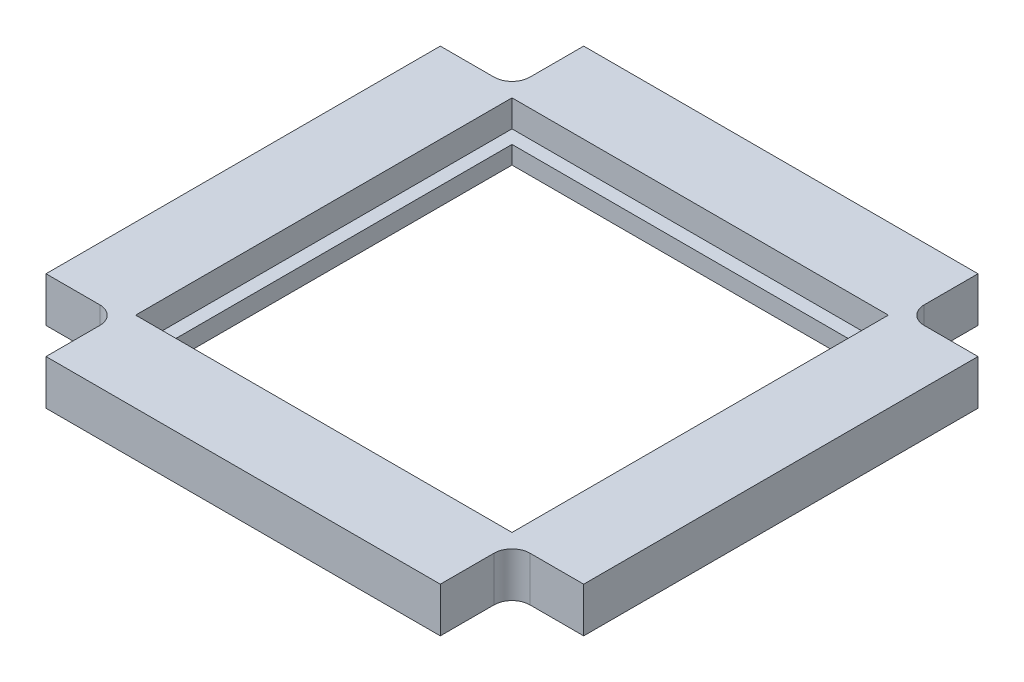
ISO-10303-21;
HEADER;
FILE_DESCRIPTION(('STEP AP214'),'2;1');
FILE_NAME('part.step','',(''),(''),'','','');
FILE_SCHEMA(('AUTOMOTIVE_DESIGN { 1 0 10303 214 1 1 1 1 }'));
ENDSEC;
DATA;
#1=APPLICATION_CONTEXT('core data for automotive mechanical design processes');
#2=APPLICATION_PROTOCOL_DEFINITION('international standard','automotive_design',2000,#1);
#3=PRODUCT_CONTEXT('',#1,'mechanical');
#4=PRODUCT('Part','Part','',(#3));
#5=PRODUCT_RELATED_PRODUCT_CATEGORY('part','',(#4));
#6=PRODUCT_DEFINITION_FORMATION('','',#4);
#7=PRODUCT_DEFINITION_CONTEXT('part definition',#1,'design');
#8=PRODUCT_DEFINITION('design','',#6,#7);
#9=PRODUCT_DEFINITION_SHAPE('','',#8);
#10=(LENGTH_UNIT() NAMED_UNIT(*) SI_UNIT(.MILLI.,.METRE.));
#11=(NAMED_UNIT(*) PLANE_ANGLE_UNIT() SI_UNIT($,.RADIAN.));
#12=(NAMED_UNIT(*) SI_UNIT($,.STERADIAN.) SOLID_ANGLE_UNIT());
#13=UNCERTAINTY_MEASURE_WITH_UNIT(LENGTH_MEASURE(1.E-05),#10,'distance_accuracy_value','');
#14=(GEOMETRIC_REPRESENTATION_CONTEXT(3) GLOBAL_UNCERTAINTY_ASSIGNED_CONTEXT((#13)) GLOBAL_UNIT_ASSIGNED_CONTEXT((#10,
#11,#12)) REPRESENTATION_CONTEXT('',''));
#15=CARTESIAN_POINT('',(0.,0.,0.));
#16=DIRECTION('',(0.,0.,1.));
#17=DIRECTION('',(1.,0.,0.));
#18=AXIS2_PLACEMENT_3D('',#15,#16,#17);
#19=CARTESIAN_POINT('',(3.,0.5,-3.));
#20=DIRECTION('',(-1.,0.,0.));
#21=DIRECTION('',(0.,0.,1.));
#22=AXIS2_PLACEMENT_3D('',#19,#20,#21);
#23=PLANE('',#22);
#24=DIRECTION('',(0.,0.,-1.));
#25=VECTOR('',#24,1.);
#26=CARTESIAN_POINT('',(3.,0.,-3.));
#27=LINE('',#26,#25);
#28=CARTESIAN_POINT('',(3.,0.,2.2));
#29=VERTEX_POINT('',#28);
#30=CARTESIAN_POINT('',(3.,0.,-2.2));
#31=VERTEX_POINT('',#30);
#32=EDGE_CURVE('E222',#29,#31,#27,.T.);
#33=ORIENTED_EDGE('',*,*,#32,.T.);
#34=DIRECTION('',(0.,1.,0.));
#35=VECTOR('',#34,1.);
#36=CARTESIAN_POINT('',(3.,0.,-2.2));
#37=LINE('',#36,#35);
#38=CARTESIAN_POINT('',(3.,0.5,-2.2));
#39=VERTEX_POINT('',#38);
#40=EDGE_CURVE('E216',#31,#39,#37,.T.);
#41=ORIENTED_EDGE('',*,*,#40,.T.);
#42=DIRECTION('',(0.,0.,-1.));
#43=VECTOR('',#42,1.);
#44=CARTESIAN_POINT('',(3.,0.5,-3.));
#45=LINE('',#44,#43);
#46=CARTESIAN_POINT('',(3.,0.5,2.2));
#47=VERTEX_POINT('',#46);
#48=EDGE_CURVE('E234',#47,#39,#45,.T.);
#49=ORIENTED_EDGE('',*,*,#48,.F.);
#50=DIRECTION('',(0.,1.,0.));
#51=VECTOR('',#50,1.);
#52=CARTESIAN_POINT('',(3.,0.,2.2));
#53=LINE('',#52,#51);
#54=EDGE_CURVE('E385',#29,#47,#53,.T.);
#55=ORIENTED_EDGE('',*,*,#54,.F.);
#56=EDGE_LOOP('',(#33,#41,#49,#55));
#57=FACE_BOUND('',#56,.T.);
#58=ADVANCED_FACE('F34',(#57),#23,.F.);
#59=CARTESIAN_POINT('',(-3.,0.5,-3.));
#60=DIRECTION('',(0.,0.,1.));
#61=DIRECTION('',(1.,0.,0.));
#62=AXIS2_PLACEMENT_3D('',#59,#60,#61);
#63=PLANE('',#62);
#64=DIRECTION('',(-1.,0.,0.));
#65=VECTOR('',#64,1.);
#66=CARTESIAN_POINT('',(-3.,0.5,-3.));
#67=LINE('',#66,#65);
#68=CARTESIAN_POINT('',(2.2,0.5,-3.));
#69=VERTEX_POINT('',#68);
#70=CARTESIAN_POINT('',(-2.2,0.5,-3.));
#71=VERTEX_POINT('',#70);
#72=EDGE_CURVE('E215',#69,#71,#67,.T.);
#73=ORIENTED_EDGE('',*,*,#72,.F.);
#74=DIRECTION('',(0.,1.,0.));
#75=VECTOR('',#74,1.);
#76=CARTESIAN_POINT('',(2.2,0.,-3.));
#77=LINE('',#76,#75);
#78=CARTESIAN_POINT('',(2.2,0.,-3.));
#79=VERTEX_POINT('',#78);
#80=EDGE_CURVE('E197',#79,#69,#77,.T.);
#81=ORIENTED_EDGE('',*,*,#80,.F.);
#82=DIRECTION('',(-1.,0.,0.));
#83=VECTOR('',#82,1.);
#84=CARTESIAN_POINT('',(-3.,0.,-3.));
#85=LINE('',#84,#83);
#86=CARTESIAN_POINT('',(-2.2,0.,-3.));
#87=VERTEX_POINT('',#86);
#88=EDGE_CURVE('E212',#79,#87,#85,.T.);
#89=ORIENTED_EDGE('',*,*,#88,.T.);
#90=DIRECTION('',(0.,1.,0.));
#91=VECTOR('',#90,1.);
#92=CARTESIAN_POINT('',(-2.2,0.,-3.));
#93=LINE('',#92,#91);
#94=EDGE_CURVE('E278',#87,#71,#93,.T.);
#95=ORIENTED_EDGE('',*,*,#94,.T.);
#96=EDGE_LOOP('',(#73,#81,#89,#95));
#97=FACE_BOUND('',#96,.T.);
#98=ADVANCED_FACE('F210',(#97),#63,.F.);
#99=CARTESIAN_POINT('',(-3.,0.5,-3.));
#100=DIRECTION('',(1.,0.,0.));
#101=DIRECTION('',(0.,0.,-1.));
#102=AXIS2_PLACEMENT_3D('',#99,#100,#101);
#103=PLANE('',#102);
#104=DIRECTION('',(0.,0.,1.));
#105=VECTOR('',#104,1.);
#106=CARTESIAN_POINT('',(-3.,0.,-3.));
#107=LINE('',#106,#105);
#108=CARTESIAN_POINT('',(-3.,0.,-2.2));
#109=VERTEX_POINT('',#108);
#110=CARTESIAN_POINT('',(-3.,0.,2.2));
#111=VERTEX_POINT('',#110);
#112=EDGE_CURVE('E221',#109,#111,#107,.T.);
#113=ORIENTED_EDGE('',*,*,#112,.T.);
#114=DIRECTION('',(0.,1.,0.));
#115=VECTOR('',#114,1.);
#116=CARTESIAN_POINT('',(-3.,0.,2.2));
#117=LINE('',#116,#115);
#118=CARTESIAN_POINT('',(-3.,0.5,2.2));
#119=VERTEX_POINT('',#118);
#120=EDGE_CURVE('E401',#111,#119,#117,.T.);
#121=ORIENTED_EDGE('',*,*,#120,.T.);
#122=DIRECTION('',(0.,0.,1.));
#123=VECTOR('',#122,1.);
#124=CARTESIAN_POINT('',(-3.,0.5,-3.));
#125=LINE('',#124,#123);
#126=CARTESIAN_POINT('',(-3.,0.5,-2.2));
#127=VERTEX_POINT('',#126);
#128=EDGE_CURVE('E369',#127,#119,#125,.T.);
#129=ORIENTED_EDGE('',*,*,#128,.F.);
#130=DIRECTION('',(0.,1.,0.));
#131=VECTOR('',#130,1.);
#132=CARTESIAN_POINT('',(-3.,0.,-2.2));
#133=LINE('',#132,#131);
#134=EDGE_CURVE('E279',#109,#127,#133,.T.);
#135=ORIENTED_EDGE('',*,*,#134,.F.);
#136=EDGE_LOOP('',(#113,#121,#129,#135));
#137=FACE_BOUND('',#136,.T.);
#138=ADVANCED_FACE('F438',(#137),#103,.F.);
#139=CARTESIAN_POINT('',(-3.,0.5,3.));
#140=DIRECTION('',(0.,0.,-1.));
#141=DIRECTION('',(-1.,0.,0.));
#142=AXIS2_PLACEMENT_3D('',#139,#140,#141);
#143=PLANE('',#142);
#144=DIRECTION('',(1.,0.,0.));
#145=VECTOR('',#144,1.);
#146=CARTESIAN_POINT('',(-3.,0.5,3.));
#147=LINE('',#146,#145);
#148=CARTESIAN_POINT('',(-2.2,0.5,3.));
#149=VERTEX_POINT('',#148);
#150=CARTESIAN_POINT('',(2.2,0.5,3.));
#151=VERTEX_POINT('',#150);
#152=EDGE_CURVE('E239',#149,#151,#147,.T.);
#153=ORIENTED_EDGE('',*,*,#152,.F.);
#154=DIRECTION('',(0.,1.,0.));
#155=VECTOR('',#154,1.);
#156=CARTESIAN_POINT('',(-2.2,0.,3.));
#157=LINE('',#156,#155);
#158=CARTESIAN_POINT('',(-2.2,0.,3.));
#159=VERTEX_POINT('',#158);
#160=EDGE_CURVE('E379',#159,#149,#157,.T.);
#161=ORIENTED_EDGE('',*,*,#160,.F.);
#162=DIRECTION('',(1.,0.,0.));
#163=VECTOR('',#162,1.);
#164=CARTESIAN_POINT('',(-3.,0.,3.));
#165=LINE('',#164,#163);
#166=CARTESIAN_POINT('',(2.2,0.,3.));
#167=VERTEX_POINT('',#166);
#168=EDGE_CURVE('E225',#159,#167,#165,.T.);
#169=ORIENTED_EDGE('',*,*,#168,.T.);
#170=DIRECTION('',(0.,1.,0.));
#171=VECTOR('',#170,1.);
#172=CARTESIAN_POINT('',(2.2,0.,3.));
#173=LINE('',#172,#171);
#174=EDGE_CURVE('E382',#167,#151,#173,.T.);
#175=ORIENTED_EDGE('',*,*,#174,.T.);
#176=EDGE_LOOP('',(#153,#161,#169,#175));
#177=FACE_BOUND('',#176,.T.);
#178=ADVANCED_FACE('F378',(#177),#143,.F.);
#179=CARTESIAN_POINT('',(0.,0.5,0.));
#180=DIRECTION('',(0.,1.,0.));
#181=DIRECTION('',(0.,0.,1.));
#182=AXIS2_PLACEMENT_3D('',#179,#180,#181);
#183=PLANE('',#182);
#184=DIRECTION('',(1.,0.,0.));
#185=VECTOR('',#184,1.);
#186=CARTESIAN_POINT('',(3.,0.5,-2.2));
#187=LINE('',#186,#185);
#188=CARTESIAN_POINT('',(2.4,0.5,-2.2));
#189=VERTEX_POINT('',#188);
#190=EDGE_CURVE('E205',#189,#39,#187,.T.);
#191=ORIENTED_EDGE('',*,*,#190,.F.);
#192=CARTESIAN_POINT('',(2.4,0.5,-2.4));
#193=DIRECTION('',(0.,1.,0.));
#194=DIRECTION('',(0.,0.,1.));
#195=AXIS2_PLACEMENT_3D('',#192,#193,#194);
#196=CIRCLE('',#195,0.2);
#197=CARTESIAN_POINT('',(2.2,0.5,-2.4));
#198=VERTEX_POINT('',#197);
#199=EDGE_CURVE('E261',#189,#198,#196,.F.);
#200=ORIENTED_EDGE('',*,*,#199,.T.);
#201=DIRECTION('',(0.,0.,1.));
#202=VECTOR('',#201,1.);
#203=CARTESIAN_POINT('',(2.2,0.5,-3.));
#204=LINE('',#203,#202);
#205=EDGE_CURVE('E405',#69,#198,#204,.T.);
#206=ORIENTED_EDGE('',*,*,#205,.F.);
#207=ORIENTED_EDGE('',*,*,#72,.T.);
#208=DIRECTION('',(0.,0.,-1.));
#209=VECTOR('',#208,1.);
#210=CARTESIAN_POINT('',(-2.2,0.5,-3.));
#211=LINE('',#210,#209);
#212=CARTESIAN_POINT('',(-2.2,0.5,-2.4));
#213=VERTEX_POINT('',#212);
#214=EDGE_CURVE('E290',#213,#71,#211,.T.);
#215=ORIENTED_EDGE('',*,*,#214,.F.);
#216=CARTESIAN_POINT('',(-2.4,0.5,-2.4));
#217=DIRECTION('',(0.,1.,0.));
#218=DIRECTION('',(0.,0.,1.));
#219=AXIS2_PLACEMENT_3D('',#216,#217,#218);
#220=CIRCLE('',#219,0.2);
#221=CARTESIAN_POINT('',(-2.4,0.5,-2.2));
#222=VERTEX_POINT('',#221);
#223=EDGE_CURVE('E265',#213,#222,#220,.F.);
#224=ORIENTED_EDGE('',*,*,#223,.T.);
#225=DIRECTION('',(1.,0.,0.));
#226=VECTOR('',#225,1.);
#227=CARTESIAN_POINT('',(-3.,0.5,-2.2));
#228=LINE('',#227,#226);
#229=EDGE_CURVE('E288',#127,#222,#228,.T.);
#230=ORIENTED_EDGE('',*,*,#229,.F.);
#231=ORIENTED_EDGE('',*,*,#128,.T.);
#232=DIRECTION('',(-1.,0.,0.));
#233=VECTOR('',#232,1.);
#234=CARTESIAN_POINT('',(-3.,0.5,2.2));
#235=LINE('',#234,#233);
#236=CARTESIAN_POINT('',(-2.4,0.5,2.2));
#237=VERTEX_POINT('',#236);
#238=EDGE_CURVE('E387',#237,#119,#235,.T.);
#239=ORIENTED_EDGE('',*,*,#238,.F.);
#240=CARTESIAN_POINT('',(-2.4,0.5,2.4));
#241=DIRECTION('',(0.,1.,0.));
#242=DIRECTION('',(0.,0.,1.));
#243=AXIS2_PLACEMENT_3D('',#240,#241,#242);
#244=CIRCLE('',#243,0.2);
#245=CARTESIAN_POINT('',(-2.2,0.5,2.4));
#246=VERTEX_POINT('',#245);
#247=EDGE_CURVE('E42',#237,#246,#244,.F.);
#248=ORIENTED_EDGE('',*,*,#247,.T.);
#249=DIRECTION('',(0.,0.,-1.));
#250=VECTOR('',#249,1.);
#251=CARTESIAN_POINT('',(-2.2,0.5,3.));
#252=LINE('',#251,#250);
#253=EDGE_CURVE('E374',#149,#246,#252,.T.);
#254=ORIENTED_EDGE('',*,*,#253,.F.);
#255=ORIENTED_EDGE('',*,*,#152,.T.);
#256=DIRECTION('',(0.,0.,1.));
#257=VECTOR('',#256,1.);
#258=CARTESIAN_POINT('',(2.2,0.5,3.));
#259=LINE('',#258,#257);
#260=CARTESIAN_POINT('',(2.2,0.5,2.4));
#261=VERTEX_POINT('',#260);
#262=EDGE_CURVE('E373',#261,#151,#259,.T.);
#263=ORIENTED_EDGE('',*,*,#262,.F.);
#264=CARTESIAN_POINT('',(2.4,0.5,2.4));
#265=DIRECTION('',(0.,1.,0.));
#266=DIRECTION('',(0.,0.,1.));
#267=AXIS2_PLACEMENT_3D('',#264,#265,#266);
#268=CIRCLE('',#267,0.2);
#269=CARTESIAN_POINT('',(2.4,0.5,2.2));
#270=VERTEX_POINT('',#269);
#271=EDGE_CURVE('E257',#261,#270,#268,.F.);
#272=ORIENTED_EDGE('',*,*,#271,.T.);
#273=DIRECTION('',(-1.,0.,0.));
#274=VECTOR('',#273,1.);
#275=CARTESIAN_POINT('',(3.,0.5,2.2));
#276=LINE('',#275,#274);
#277=EDGE_CURVE('E394',#47,#270,#276,.T.);
#278=ORIENTED_EDGE('',*,*,#277,.F.);
#279=ORIENTED_EDGE('',*,*,#48,.T.);
#280=EDGE_LOOP('',(#191,#200,#206,#207,#215,#224,#230,#231,#239,#248,#254,#255,#263,#272,#278,#279));
#281=FACE_BOUND('',#280,.T.);
#282=DIRECTION('',(0.,0.,1.));
#283=VECTOR('',#282,1.);
#284=CARTESIAN_POINT('',(-2.1,0.5,-2.1));
#285=LINE('',#284,#283);
#286=CARTESIAN_POINT('',(-2.1,0.5,-2.1));
#287=VERTEX_POINT('',#286);
#288=CARTESIAN_POINT('',(-2.1,0.5,2.1));
#289=VERTEX_POINT('',#288);
#290=EDGE_CURVE('E301',#287,#289,#285,.T.);
#291=ORIENTED_EDGE('',*,*,#290,.F.);
#292=DIRECTION('',(-1.,0.,0.));
#293=VECTOR('',#292,1.);
#294=CARTESIAN_POINT('',(2.1,0.5,-2.1));
#295=LINE('',#294,#293);
#296=CARTESIAN_POINT('',(2.1,0.5,-2.1));
#297=VERTEX_POINT('',#296);
#298=EDGE_CURVE('E307',#297,#287,#295,.T.);
#299=ORIENTED_EDGE('',*,*,#298,.F.);
#300=DIRECTION('',(0.,0.,-1.));
#301=VECTOR('',#300,1.);
#302=CARTESIAN_POINT('',(2.1,0.5,-2.1));
#303=LINE('',#302,#301);
#304=CARTESIAN_POINT('',(2.1,0.5,2.1));
#305=VERTEX_POINT('',#304);
#306=EDGE_CURVE('E321',#305,#297,#303,.T.);
#307=ORIENTED_EDGE('',*,*,#306,.F.);
#308=DIRECTION('',(1.,0.,0.));
#309=VECTOR('',#308,1.);
#310=CARTESIAN_POINT('',(2.1,0.5,2.1));
#311=LINE('',#310,#309);
#312=EDGE_CURVE('E318',#289,#305,#311,.T.);
#313=ORIENTED_EDGE('',*,*,#312,.F.);
#314=EDGE_LOOP('',(#291,#299,#307,#313));
#315=FACE_BOUND('',#314,.T.);
#316=ADVANCED_FACE('F285',(#281,#315),#183,.T.);
#317=CARTESIAN_POINT('',(0.,0.,0.));
#318=DIRECTION('',(0.,1.,0.));
#319=DIRECTION('',(0.,0.,1.));
#320=AXIS2_PLACEMENT_3D('',#317,#318,#319);
#321=PLANE('',#320);
#322=DIRECTION('',(1.,0.,0.));
#323=VECTOR('',#322,1.);
#324=CARTESIAN_POINT('',(-1.95,0.,1.95));
#325=LINE('',#324,#323);
#326=CARTESIAN_POINT('',(-1.95,0.,1.95));
#327=VERTEX_POINT('',#326);
#328=CARTESIAN_POINT('',(1.95,0.,1.95));
#329=VERTEX_POINT('',#328);
#330=EDGE_CURVE('E352',#327,#329,#325,.T.);
#331=ORIENTED_EDGE('',*,*,#330,.T.);
#332=DIRECTION('',(0.,0.,-1.));
#333=VECTOR('',#332,1.);
#334=CARTESIAN_POINT('',(1.95,0.,-1.95));
#335=LINE('',#334,#333);
#336=CARTESIAN_POINT('',(1.95,0.,-1.95));
#337=VERTEX_POINT('',#336);
#338=EDGE_CURVE('E343',#329,#337,#335,.T.);
#339=ORIENTED_EDGE('',*,*,#338,.T.);
#340=DIRECTION('',(-1.,0.,0.));
#341=VECTOR('',#340,1.);
#342=CARTESIAN_POINT('',(-1.95,0.,-1.95));
#343=LINE('',#342,#341);
#344=CARTESIAN_POINT('',(-1.95,0.,-1.95));
#345=VERTEX_POINT('',#344);
#346=EDGE_CURVE('E346',#337,#345,#343,.T.);
#347=ORIENTED_EDGE('',*,*,#346,.T.);
#348=DIRECTION('',(0.,0.,1.));
#349=VECTOR('',#348,1.);
#350=CARTESIAN_POINT('',(-1.95,0.,-1.95));
#351=LINE('',#350,#349);
#352=EDGE_CURVE('E349',#345,#327,#351,.T.);
#353=ORIENTED_EDGE('',*,*,#352,.T.);
#354=EDGE_LOOP('',(#331,#339,#347,#353));
#355=FACE_BOUND('',#354,.T.);
#356=DIRECTION('',(0.,0.,1.));
#357=VECTOR('',#356,1.);
#358=CARTESIAN_POINT('',(2.2,0.,-3.));
#359=LINE('',#358,#357);
#360=CARTESIAN_POINT('',(2.2,0.,-2.4));
#361=VERTEX_POINT('',#360);
#362=EDGE_CURVE('E193',#79,#361,#359,.T.);
#363=ORIENTED_EDGE('',*,*,#362,.T.);
#364=CARTESIAN_POINT('',(2.4,0.,-2.4));
#365=DIRECTION('',(0.,1.,0.));
#366=DIRECTION('',(0.,0.,1.));
#367=AXIS2_PLACEMENT_3D('',#364,#365,#366);
#368=CIRCLE('',#367,0.2);
#369=CARTESIAN_POINT('',(2.4,0.,-2.2));
#370=VERTEX_POINT('',#369);
#371=EDGE_CURVE('E263',#361,#370,#368,.T.);
#372=ORIENTED_EDGE('',*,*,#371,.T.);
#373=DIRECTION('',(1.,0.,0.));
#374=VECTOR('',#373,1.);
#375=CARTESIAN_POINT('',(3.,0.,-2.2));
#376=LINE('',#375,#374);
#377=EDGE_CURVE('E204',#370,#31,#376,.T.);
#378=ORIENTED_EDGE('',*,*,#377,.T.);
#379=ORIENTED_EDGE('',*,*,#32,.F.);
#380=DIRECTION('',(-1.,0.,0.));
#381=VECTOR('',#380,1.);
#382=CARTESIAN_POINT('',(3.,0.,2.2));
#383=LINE('',#382,#381);
#384=CARTESIAN_POINT('',(2.4,0.,2.2));
#385=VERTEX_POINT('',#384);
#386=EDGE_CURVE('E393',#29,#385,#383,.T.);
#387=ORIENTED_EDGE('',*,*,#386,.T.);
#388=CARTESIAN_POINT('',(2.4,0.,2.4));
#389=DIRECTION('',(0.,1.,0.));
#390=DIRECTION('',(0.,0.,1.));
#391=AXIS2_PLACEMENT_3D('',#388,#389,#390);
#392=CIRCLE('',#391,0.2);
#393=CARTESIAN_POINT('',(2.2,0.,2.4));
#394=VERTEX_POINT('',#393);
#395=EDGE_CURVE('E259',#385,#394,#392,.T.);
#396=ORIENTED_EDGE('',*,*,#395,.T.);
#397=DIRECTION('',(0.,0.,1.));
#398=VECTOR('',#397,1.);
#399=CARTESIAN_POINT('',(2.2,0.,3.));
#400=LINE('',#399,#398);
#401=EDGE_CURVE('E389',#394,#167,#400,.T.);
#402=ORIENTED_EDGE('',*,*,#401,.T.);
#403=ORIENTED_EDGE('',*,*,#168,.F.);
#404=DIRECTION('',(0.,0.,-1.));
#405=VECTOR('',#404,1.);
#406=CARTESIAN_POINT('',(-2.2,0.,3.));
#407=LINE('',#406,#405);
#408=CARTESIAN_POINT('',(-2.2,0.,2.4));
#409=VERTEX_POINT('',#408);
#410=EDGE_CURVE('E406',#159,#409,#407,.T.);
#411=ORIENTED_EDGE('',*,*,#410,.T.);
#412=CARTESIAN_POINT('',(-2.4,0.,2.4));
#413=DIRECTION('',(0.,1.,0.));
#414=DIRECTION('',(0.,0.,1.));
#415=AXIS2_PLACEMENT_3D('',#412,#413,#414);
#416=CIRCLE('',#415,0.2);
#417=CARTESIAN_POINT('',(-2.4,0.,2.2));
#418=VERTEX_POINT('',#417);
#419=EDGE_CURVE('E11',#409,#418,#416,.T.);
#420=ORIENTED_EDGE('',*,*,#419,.T.);
#421=DIRECTION('',(-1.,0.,0.));
#422=VECTOR('',#421,1.);
#423=CARTESIAN_POINT('',(-3.,0.,2.2));
#424=LINE('',#423,#422);
#425=EDGE_CURVE('E402',#418,#111,#424,.T.);
#426=ORIENTED_EDGE('',*,*,#425,.T.);
#427=ORIENTED_EDGE('',*,*,#112,.F.);
#428=DIRECTION('',(1.,0.,0.));
#429=VECTOR('',#428,1.);
#430=CARTESIAN_POINT('',(-3.,0.,-2.2));
#431=LINE('',#430,#429);
#432=CARTESIAN_POINT('',(-2.4,0.,-2.2));
#433=VERTEX_POINT('',#432);
#434=EDGE_CURVE('E271',#109,#433,#431,.T.);
#435=ORIENTED_EDGE('',*,*,#434,.T.);
#436=CARTESIAN_POINT('',(-2.4,0.,-2.4));
#437=DIRECTION('',(0.,1.,0.));
#438=DIRECTION('',(0.,0.,1.));
#439=AXIS2_PLACEMENT_3D('',#436,#437,#438);
#440=CIRCLE('',#439,0.2);
#441=CARTESIAN_POINT('',(-2.2,0.,-2.4));
#442=VERTEX_POINT('',#441);
#443=EDGE_CURVE('E267',#433,#442,#440,.T.);
#444=ORIENTED_EDGE('',*,*,#443,.T.);
#445=DIRECTION('',(0.,0.,-1.));
#446=VECTOR('',#445,1.);
#447=CARTESIAN_POINT('',(-2.2,0.,-3.));
#448=LINE('',#447,#446);
#449=EDGE_CURVE('E220',#442,#87,#448,.T.);
#450=ORIENTED_EDGE('',*,*,#449,.T.);
#451=ORIENTED_EDGE('',*,*,#88,.F.);
#452=EDGE_LOOP('',(#363,#372,#378,#379,#387,#396,#402,#403,#411,#420,#426,#427,#435,#444,#450,#451));
#453=FACE_BOUND('',#452,.T.);
#454=ADVANCED_FACE('F218',(#355,#453),#321,.F.);
#455=CARTESIAN_POINT('',(1.95,0.,-1.95));
#456=DIRECTION('',(1.,0.,0.));
#457=DIRECTION('',(0.,0.,-1.));
#458=AXIS2_PLACEMENT_3D('',#455,#456,#457);
#459=PLANE('',#458);
#460=DIRECTION('',(0.,1.,0.));
#461=VECTOR('',#460,1.);
#462=CARTESIAN_POINT('',(1.95,0.,1.95));
#463=LINE('',#462,#461);
#464=CARTESIAN_POINT('',(1.95,0.2,1.95));
#465=VERTEX_POINT('',#464);
#466=EDGE_CURVE('E228',#329,#465,#463,.T.);
#467=ORIENTED_EDGE('',*,*,#466,.T.);
#468=DIRECTION('',(0.,0.,-1.));
#469=VECTOR('',#468,1.);
#470=CARTESIAN_POINT('',(1.95,0.2,-1.95));
#471=LINE('',#470,#469);
#472=CARTESIAN_POINT('',(1.95,0.2,-1.95));
#473=VERTEX_POINT('',#472);
#474=EDGE_CURVE('E340',#465,#473,#471,.T.);
#475=ORIENTED_EDGE('',*,*,#474,.T.);
#476=DIRECTION('',(0.,1.,0.));
#477=VECTOR('',#476,1.);
#478=CARTESIAN_POINT('',(1.95,0.,-1.95));
#479=LINE('',#478,#477);
#480=EDGE_CURVE('E355',#337,#473,#479,.T.);
#481=ORIENTED_EDGE('',*,*,#480,.F.);
#482=ORIENTED_EDGE('',*,*,#338,.F.);
#483=EDGE_LOOP('',(#467,#475,#481,#482));
#484=FACE_BOUND('',#483,.T.);
#485=ADVANCED_FACE('F556',(#484),#459,.F.);
#486=CARTESIAN_POINT('',(-1.95,0.,1.95));
#487=DIRECTION('',(0.,0.,1.));
#488=DIRECTION('',(1.,0.,0.));
#489=AXIS2_PLACEMENT_3D('',#486,#487,#488);
#490=PLANE('',#489);
#491=DIRECTION('',(0.,1.,0.));
#492=VECTOR('',#491,1.);
#493=CARTESIAN_POINT('',(-1.95,0.,1.95));
#494=LINE('',#493,#492);
#495=CARTESIAN_POINT('',(-1.95,0.2,1.95));
#496=VERTEX_POINT('',#495);
#497=EDGE_CURVE('E358',#327,#496,#494,.T.);
#498=ORIENTED_EDGE('',*,*,#497,.T.);
#499=DIRECTION('',(1.,0.,0.));
#500=VECTOR('',#499,1.);
#501=CARTESIAN_POINT('',(-1.95,0.2,1.95));
#502=LINE('',#501,#500);
#503=EDGE_CURVE('E337',#496,#465,#502,.T.);
#504=ORIENTED_EDGE('',*,*,#503,.T.);
#505=ORIENTED_EDGE('',*,*,#466,.F.);
#506=ORIENTED_EDGE('',*,*,#330,.F.);
#507=EDGE_LOOP('',(#498,#504,#505,#506));
#508=FACE_BOUND('',#507,.T.);
#509=ADVANCED_FACE('F654',(#508),#490,.F.);
#510=CARTESIAN_POINT('',(-1.95,0.,-1.95));
#511=DIRECTION('',(-1.,0.,0.));
#512=DIRECTION('',(0.,0.,1.));
#513=AXIS2_PLACEMENT_3D('',#510,#511,#512);
#514=PLANE('',#513);
#515=DIRECTION('',(0.,1.,0.));
#516=VECTOR('',#515,1.);
#517=CARTESIAN_POINT('',(-1.95,0.,-1.95));
#518=LINE('',#517,#516);
#519=CARTESIAN_POINT('',(-1.95,0.2,-1.95));
#520=VERTEX_POINT('',#519);
#521=EDGE_CURVE('E361',#345,#520,#518,.T.);
#522=ORIENTED_EDGE('',*,*,#521,.T.);
#523=DIRECTION('',(0.,0.,1.));
#524=VECTOR('',#523,1.);
#525=CARTESIAN_POINT('',(-1.95,0.2,-1.95));
#526=LINE('',#525,#524);
#527=EDGE_CURVE('E328',#520,#496,#526,.T.);
#528=ORIENTED_EDGE('',*,*,#527,.T.);
#529=ORIENTED_EDGE('',*,*,#497,.F.);
#530=ORIENTED_EDGE('',*,*,#352,.F.);
#531=EDGE_LOOP('',(#522,#528,#529,#530));
#532=FACE_BOUND('',#531,.T.);
#533=ADVANCED_FACE('F644',(#532),#514,.F.);
#534=CARTESIAN_POINT('',(-1.95,0.,-1.95));
#535=DIRECTION('',(0.,0.,-1.));
#536=DIRECTION('',(-1.,0.,0.));
#537=AXIS2_PLACEMENT_3D('',#534,#535,#536);
#538=PLANE('',#537);
#539=ORIENTED_EDGE('',*,*,#480,.T.);
#540=DIRECTION('',(-1.,0.,0.));
#541=VECTOR('',#540,1.);
#542=CARTESIAN_POINT('',(-1.95,0.2,-1.95));
#543=LINE('',#542,#541);
#544=EDGE_CURVE('E235',#473,#520,#543,.T.);
#545=ORIENTED_EDGE('',*,*,#544,.T.);
#546=ORIENTED_EDGE('',*,*,#521,.F.);
#547=ORIENTED_EDGE('',*,*,#346,.F.);
#548=EDGE_LOOP('',(#539,#545,#546,#547));
#549=FACE_BOUND('',#548,.T.);
#550=ADVANCED_FACE('F634',(#549),#538,.F.);
#551=CARTESIAN_POINT('',(0.,0.2,0.));
#552=DIRECTION('',(0.,-1.,0.));
#553=DIRECTION('',(0.,0.,-1.));
#554=AXIS2_PLACEMENT_3D('',#551,#552,#553);
#555=PLANE('',#554);
#556=DIRECTION('',(0.,0.,1.));
#557=VECTOR('',#556,1.);
#558=CARTESIAN_POINT('',(-2.1,0.2,-2.1));
#559=LINE('',#558,#557);
#560=CARTESIAN_POINT('',(-2.1,0.2,-2.1));
#561=VERTEX_POINT('',#560);
#562=CARTESIAN_POINT('',(-2.1,0.2,2.1));
#563=VERTEX_POINT('',#562);
#564=EDGE_CURVE('E303',#561,#563,#559,.T.);
#565=ORIENTED_EDGE('',*,*,#564,.T.);
#566=DIRECTION('',(1.,0.,0.));
#567=VECTOR('',#566,1.);
#568=CARTESIAN_POINT('',(2.1,0.2,2.1));
#569=LINE('',#568,#567);
#570=CARTESIAN_POINT('',(2.1,0.2,2.1));
#571=VERTEX_POINT('',#570);
#572=EDGE_CURVE('E306',#563,#571,#569,.T.);
#573=ORIENTED_EDGE('',*,*,#572,.T.);
#574=DIRECTION('',(0.,0.,-1.));
#575=VECTOR('',#574,1.);
#576=CARTESIAN_POINT('',(2.1,0.2,-2.1));
#577=LINE('',#576,#575);
#578=CARTESIAN_POINT('',(2.1,0.2,-2.1));
#579=VERTEX_POINT('',#578);
#580=EDGE_CURVE('E310',#571,#579,#577,.T.);
#581=ORIENTED_EDGE('',*,*,#580,.T.);
#582=DIRECTION('',(-1.,0.,0.));
#583=VECTOR('',#582,1.);
#584=CARTESIAN_POINT('',(2.1,0.2,-2.1));
#585=LINE('',#584,#583);
#586=EDGE_CURVE('E313',#579,#561,#585,.T.);
#587=ORIENTED_EDGE('',*,*,#586,.T.);
#588=EDGE_LOOP('',(#565,#573,#581,#587));
#589=FACE_BOUND('',#588,.T.);
#590=ORIENTED_EDGE('',*,*,#503,.F.);
#591=ORIENTED_EDGE('',*,*,#527,.F.);
#592=ORIENTED_EDGE('',*,*,#544,.F.);
#593=ORIENTED_EDGE('',*,*,#474,.F.);
#594=EDGE_LOOP('',(#590,#591,#592,#593));
#595=FACE_BOUND('',#594,.T.);
#596=ADVANCED_FACE('F624',(#589,#595),#555,.F.);
#597=CARTESIAN_POINT('',(-2.1,0.2,-2.1));
#598=DIRECTION('',(-1.,0.,0.));
#599=DIRECTION('',(0.,0.,1.));
#600=AXIS2_PLACEMENT_3D('',#597,#598,#599);
#601=PLANE('',#600);
#602=ORIENTED_EDGE('',*,*,#290,.T.);
#603=DIRECTION('',(0.,1.,0.));
#604=VECTOR('',#603,1.);
#605=CARTESIAN_POINT('',(-2.1,0.2,2.1));
#606=LINE('',#605,#604);
#607=EDGE_CURVE('E316',#563,#289,#606,.T.);
#608=ORIENTED_EDGE('',*,*,#607,.F.);
#609=ORIENTED_EDGE('',*,*,#564,.F.);
#610=DIRECTION('',(0.,1.,0.));
#611=VECTOR('',#610,1.);
#612=CARTESIAN_POINT('',(-2.1,0.2,-2.1));
#613=LINE('',#612,#611);
#614=EDGE_CURVE('E326',#561,#287,#613,.T.);
#615=ORIENTED_EDGE('',*,*,#614,.T.);
#616=EDGE_LOOP('',(#602,#608,#609,#615));
#617=FACE_BOUND('',#616,.T.);
#618=ADVANCED_FACE('F614',(#617),#601,.F.);
#619=CARTESIAN_POINT('',(2.1,0.2,-2.1));
#620=DIRECTION('',(0.,0.,-1.));
#621=DIRECTION('',(-1.,0.,0.));
#622=AXIS2_PLACEMENT_3D('',#619,#620,#621);
#623=PLANE('',#622);
#624=ORIENTED_EDGE('',*,*,#298,.T.);
#625=ORIENTED_EDGE('',*,*,#614,.F.);
#626=ORIENTED_EDGE('',*,*,#586,.F.);
#627=DIRECTION('',(0.,1.,0.));
#628=VECTOR('',#627,1.);
#629=CARTESIAN_POINT('',(2.1,0.2,-2.1));
#630=LINE('',#629,#628);
#631=EDGE_CURVE('E329',#579,#297,#630,.T.);
#632=ORIENTED_EDGE('',*,*,#631,.T.);
#633=EDGE_LOOP('',(#624,#625,#626,#632));
#634=FACE_BOUND('',#633,.T.);
#635=ADVANCED_FACE('F604',(#634),#623,.F.);
#636=CARTESIAN_POINT('',(2.1,0.2,-2.1));
#637=DIRECTION('',(1.,0.,0.));
#638=DIRECTION('',(0.,0.,-1.));
#639=AXIS2_PLACEMENT_3D('',#636,#637,#638);
#640=PLANE('',#639);
#641=ORIENTED_EDGE('',*,*,#306,.T.);
#642=ORIENTED_EDGE('',*,*,#631,.F.);
#643=ORIENTED_EDGE('',*,*,#580,.F.);
#644=DIRECTION('',(0.,1.,0.));
#645=VECTOR('',#644,1.);
#646=CARTESIAN_POINT('',(2.1,0.2,2.1));
#647=LINE('',#646,#645);
#648=EDGE_CURVE('E331',#571,#305,#647,.T.);
#649=ORIENTED_EDGE('',*,*,#648,.T.);
#650=EDGE_LOOP('',(#641,#642,#643,#649));
#651=FACE_BOUND('',#650,.T.);
#652=ADVANCED_FACE('F594',(#651),#640,.F.);
#653=CARTESIAN_POINT('',(2.1,0.2,2.1));
#654=DIRECTION('',(0.,0.,1.));
#655=DIRECTION('',(1.,0.,0.));
#656=AXIS2_PLACEMENT_3D('',#653,#654,#655);
#657=PLANE('',#656);
#658=ORIENTED_EDGE('',*,*,#312,.T.);
#659=ORIENTED_EDGE('',*,*,#648,.F.);
#660=ORIENTED_EDGE('',*,*,#572,.F.);
#661=ORIENTED_EDGE('',*,*,#607,.T.);
#662=EDGE_LOOP('',(#658,#659,#660,#661));
#663=FACE_BOUND('',#662,.T.);
#664=ADVANCED_FACE('F545',(#663),#657,.F.);
#665=CARTESIAN_POINT('',(-2.2,0.,-3.));
#666=DIRECTION('',(1.,0.,0.));
#667=DIRECTION('',(0.,0.,-1.));
#668=AXIS2_PLACEMENT_3D('',#665,#666,#667);
#669=PLANE('',#668);
#670=ORIENTED_EDGE('',*,*,#449,.F.);
#671=DIRECTION('',(0.,1.,0.));
#672=VECTOR('',#671,1.);
#673=CARTESIAN_POINT('',(-2.2,0.5,-2.4));
#674=LINE('',#673,#672);
#675=EDGE_CURVE('E248',#442,#213,#674,.T.);
#676=ORIENTED_EDGE('',*,*,#675,.T.);
#677=ORIENTED_EDGE('',*,*,#214,.T.);
#678=ORIENTED_EDGE('',*,*,#94,.F.);
#679=EDGE_LOOP('',(#670,#676,#677,#678));
#680=FACE_BOUND('',#679,.T.);
#681=ADVANCED_FACE('F276',(#680),#669,.F.);
#682=CARTESIAN_POINT('',(-3.,0.,-2.2));
#683=DIRECTION('',(0.,0.,1.));
#684=DIRECTION('',(1.,0.,0.));
#685=AXIS2_PLACEMENT_3D('',#682,#683,#684);
#686=PLANE('',#685);
#687=ORIENTED_EDGE('',*,*,#229,.T.);
#688=DIRECTION('',(0.,1.,0.));
#689=VECTOR('',#688,1.);
#690=CARTESIAN_POINT('',(-2.4,0.,-2.2));
#691=LINE('',#690,#689);
#692=EDGE_CURVE('E251',#222,#433,#691,.F.);
#693=ORIENTED_EDGE('',*,*,#692,.T.);
#694=ORIENTED_EDGE('',*,*,#434,.F.);
#695=ORIENTED_EDGE('',*,*,#134,.T.);
#696=EDGE_LOOP('',(#687,#693,#694,#695));
#697=FACE_BOUND('',#696,.T.);
#698=ADVANCED_FACE('F292',(#697),#686,.F.);
#699=CARTESIAN_POINT('',(2.2,0.,3.));
#700=DIRECTION('',(-1.,0.,0.));
#701=DIRECTION('',(0.,0.,1.));
#702=AXIS2_PLACEMENT_3D('',#699,#700,#701);
#703=PLANE('',#702);
#704=ORIENTED_EDGE('',*,*,#401,.F.);
#705=DIRECTION('',(0.,1.,0.));
#706=VECTOR('',#705,1.);
#707=CARTESIAN_POINT('',(2.2,0.5,2.4));
#708=LINE('',#707,#706);
#709=EDGE_CURVE('E238',#394,#261,#708,.T.);
#710=ORIENTED_EDGE('',*,*,#709,.T.);
#711=ORIENTED_EDGE('',*,*,#262,.T.);
#712=ORIENTED_EDGE('',*,*,#174,.F.);
#713=EDGE_LOOP('',(#704,#710,#711,#712));
#714=FACE_BOUND('',#713,.T.);
#715=ADVANCED_FACE('F429',(#714),#703,.F.);
#716=CARTESIAN_POINT('',(3.,0.,2.2));
#717=DIRECTION('',(0.,0.,-1.));
#718=DIRECTION('',(-1.,0.,0.));
#719=AXIS2_PLACEMENT_3D('',#716,#717,#718);
#720=PLANE('',#719);
#721=ORIENTED_EDGE('',*,*,#277,.T.);
#722=DIRECTION('',(0.,1.,0.));
#723=VECTOR('',#722,1.);
#724=CARTESIAN_POINT('',(2.4,0.,2.2));
#725=LINE('',#724,#723);
#726=EDGE_CURVE('E242',#270,#385,#725,.F.);
#727=ORIENTED_EDGE('',*,*,#726,.T.);
#728=ORIENTED_EDGE('',*,*,#386,.F.);
#729=ORIENTED_EDGE('',*,*,#54,.T.);
#730=EDGE_LOOP('',(#721,#727,#728,#729));
#731=FACE_BOUND('',#730,.T.);
#732=ADVANCED_FACE('F423',(#731),#720,.F.);
#733=CARTESIAN_POINT('',(-3.,0.,2.2));
#734=DIRECTION('',(0.,0.,-1.));
#735=DIRECTION('',(-1.,0.,0.));
#736=AXIS2_PLACEMENT_3D('',#733,#734,#735);
#737=PLANE('',#736);
#738=ORIENTED_EDGE('',*,*,#425,.F.);
#739=DIRECTION('',(0.,1.,0.));
#740=VECTOR('',#739,1.);
#741=CARTESIAN_POINT('',(-2.4,0.5,2.2));
#742=LINE('',#741,#740);
#743=EDGE_CURVE('E253',#418,#237,#742,.T.);
#744=ORIENTED_EDGE('',*,*,#743,.T.);
#745=ORIENTED_EDGE('',*,*,#238,.T.);
#746=ORIENTED_EDGE('',*,*,#120,.F.);
#747=EDGE_LOOP('',(#738,#744,#745,#746));
#748=FACE_BOUND('',#747,.T.);
#749=ADVANCED_FACE('F435',(#748),#737,.F.);
#750=CARTESIAN_POINT('',(-2.2,0.,3.));
#751=DIRECTION('',(1.,0.,0.));
#752=DIRECTION('',(0.,0.,-1.));
#753=AXIS2_PLACEMENT_3D('',#750,#751,#752);
#754=PLANE('',#753);
#755=ORIENTED_EDGE('',*,*,#253,.T.);
#756=DIRECTION('',(0.,1.,0.));
#757=VECTOR('',#756,1.);
#758=CARTESIAN_POINT('',(-2.2,0.,2.4));
#759=LINE('',#758,#757);
#760=EDGE_CURVE('E49',#246,#409,#759,.F.);
#761=ORIENTED_EDGE('',*,*,#760,.T.);
#762=ORIENTED_EDGE('',*,*,#410,.F.);
#763=ORIENTED_EDGE('',*,*,#160,.T.);
#764=EDGE_LOOP('',(#755,#761,#762,#763));
#765=FACE_BOUND('',#764,.T.);
#766=ADVANCED_FACE('F496',(#765),#754,.F.);
#767=CARTESIAN_POINT('',(3.,0.,-2.2));
#768=DIRECTION('',(0.,0.,1.));
#769=DIRECTION('',(1.,0.,0.));
#770=AXIS2_PLACEMENT_3D('',#767,#768,#769);
#771=PLANE('',#770);
#772=ORIENTED_EDGE('',*,*,#377,.F.);
#773=DIRECTION('',(0.,1.,0.));
#774=VECTOR('',#773,1.);
#775=CARTESIAN_POINT('',(2.4,0.5,-2.2));
#776=LINE('',#775,#774);
#777=EDGE_CURVE('E244',#370,#189,#776,.T.);
#778=ORIENTED_EDGE('',*,*,#777,.T.);
#779=ORIENTED_EDGE('',*,*,#190,.T.);
#780=ORIENTED_EDGE('',*,*,#40,.F.);
#781=EDGE_LOOP('',(#772,#778,#779,#780));
#782=FACE_BOUND('',#781,.T.);
#783=ADVANCED_FACE('F417',(#782),#771,.F.);
#784=CARTESIAN_POINT('',(2.2,0.,-3.));
#785=DIRECTION('',(-1.,0.,0.));
#786=DIRECTION('',(0.,0.,1.));
#787=AXIS2_PLACEMENT_3D('',#784,#785,#786);
#788=PLANE('',#787);
#789=ORIENTED_EDGE('',*,*,#205,.T.);
#790=DIRECTION('',(0.,1.,0.));
#791=VECTOR('',#790,1.);
#792=CARTESIAN_POINT('',(2.2,0.,-2.4));
#793=LINE('',#792,#791);
#794=EDGE_CURVE('E200',#198,#361,#793,.F.);
#795=ORIENTED_EDGE('',*,*,#794,.T.);
#796=ORIENTED_EDGE('',*,*,#362,.F.);
#797=ORIENTED_EDGE('',*,*,#80,.T.);
#798=EDGE_LOOP('',(#789,#795,#796,#797));
#799=FACE_BOUND('',#798,.T.);
#800=ADVANCED_FACE('F196',(#799),#788,.F.);
#801=CARTESIAN_POINT('',(2.4,0.,2.4));
#802=DIRECTION('',(0.,-1.,0.));
#803=DIRECTION('',(0.,0.,-1.));
#804=AXIS2_PLACEMENT_3D('',#801,#802,#803);
#805=CYLINDRICAL_SURFACE('',#804,0.2);
#806=ORIENTED_EDGE('',*,*,#395,.F.);
#807=ORIENTED_EDGE('',*,*,#726,.F.);
#808=ORIENTED_EDGE('',*,*,#271,.F.);
#809=ORIENTED_EDGE('',*,*,#709,.F.);
#810=EDGE_LOOP('',(#806,#807,#808,#809));
#811=FACE_BOUND('',#810,.T.);
#812=ADVANCED_FACE('F428',(#811),#805,.F.);
#813=CARTESIAN_POINT('',(2.4,0.,-2.4));
#814=DIRECTION('',(0.,-1.,0.));
#815=DIRECTION('',(0.,0.,-1.));
#816=AXIS2_PLACEMENT_3D('',#813,#814,#815);
#817=CYLINDRICAL_SURFACE('',#816,0.2);
#818=ORIENTED_EDGE('',*,*,#371,.F.);
#819=ORIENTED_EDGE('',*,*,#794,.F.);
#820=ORIENTED_EDGE('',*,*,#199,.F.);
#821=ORIENTED_EDGE('',*,*,#777,.F.);
#822=EDGE_LOOP('',(#818,#819,#820,#821));
#823=FACE_BOUND('',#822,.T.);
#824=ADVANCED_FACE('F454',(#823),#817,.F.);
#825=CARTESIAN_POINT('',(-2.4,0.,-2.4));
#826=DIRECTION('',(0.,-1.,0.));
#827=DIRECTION('',(0.,0.,-1.));
#828=AXIS2_PLACEMENT_3D('',#825,#826,#827);
#829=CYLINDRICAL_SURFACE('',#828,0.2);
#830=ORIENTED_EDGE('',*,*,#443,.F.);
#831=ORIENTED_EDGE('',*,*,#692,.F.);
#832=ORIENTED_EDGE('',*,*,#223,.F.);
#833=ORIENTED_EDGE('',*,*,#675,.F.);
#834=EDGE_LOOP('',(#830,#831,#832,#833));
#835=FACE_BOUND('',#834,.T.);
#836=ADVANCED_FACE('F281',(#835),#829,.F.);
#837=CARTESIAN_POINT('',(-2.4,0.,2.4));
#838=DIRECTION('',(0.,-1.,0.));
#839=DIRECTION('',(0.,0.,-1.));
#840=AXIS2_PLACEMENT_3D('',#837,#838,#839);
#841=CYLINDRICAL_SURFACE('',#840,0.2);
#842=ORIENTED_EDGE('',*,*,#419,.F.);
#843=ORIENTED_EDGE('',*,*,#760,.F.);
#844=ORIENTED_EDGE('',*,*,#247,.F.);
#845=ORIENTED_EDGE('',*,*,#743,.F.);
#846=EDGE_LOOP('',(#842,#843,#844,#845));
#847=FACE_BOUND('',#846,.T.);
#848=ADVANCED_FACE('F36',(#847),#841,.F.);
#849=CLOSED_SHELL('',(#58,#98,#138,#178,#316,#454,#485,#509,#533,#550,#596,#618,#635,#652,#664,
#681,#698,#715,#732,#749,#766,#783,#800,#812,#824,#836,#848));
#850=MANIFOLD_SOLID_BREP('B2',#849);
#851=ADVANCED_BREP_SHAPE_REPRESENTATION('',(#18,#850),#14);
#852=SHAPE_DEFINITION_REPRESENTATION(#9,#851);
ENDSEC;
END-ISO-10303-21;
